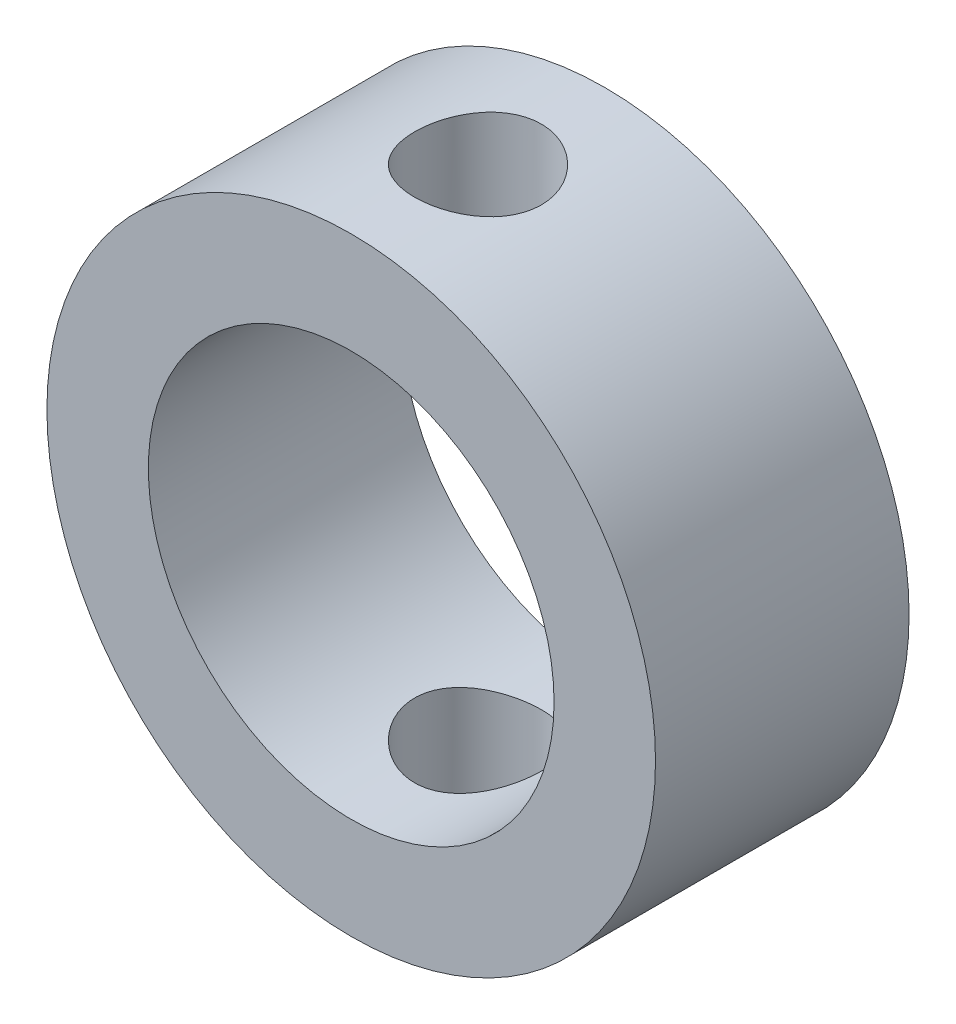
ISO-10303-21;
HEADER;
FILE_DESCRIPTION(('STEP AP214'),'2;1');
FILE_NAME('part.step','',(''),(''),'','','');
FILE_SCHEMA(('AUTOMOTIVE_DESIGN { 1 0 10303 214 1 1 1 1 }'));
ENDSEC;
DATA;
#1=APPLICATION_CONTEXT('core data for automotive mechanical design processes');
#2=APPLICATION_PROTOCOL_DEFINITION('international standard','automotive_design',2000,#1);
#3=PRODUCT_CONTEXT('',#1,'mechanical');
#4=PRODUCT('Part','Part','',(#3));
#5=PRODUCT_RELATED_PRODUCT_CATEGORY('part','',(#4));
#6=PRODUCT_DEFINITION_FORMATION('','',#4);
#7=PRODUCT_DEFINITION_CONTEXT('part definition',#1,'design');
#8=PRODUCT_DEFINITION('design','',#6,#7);
#9=PRODUCT_DEFINITION_SHAPE('','',#8);
#10=(LENGTH_UNIT() NAMED_UNIT(*) SI_UNIT(.MILLI.,.METRE.));
#11=(NAMED_UNIT(*) PLANE_ANGLE_UNIT() SI_UNIT($,.RADIAN.));
#12=(NAMED_UNIT(*) SI_UNIT($,.STERADIAN.) SOLID_ANGLE_UNIT());
#13=UNCERTAINTY_MEASURE_WITH_UNIT(LENGTH_MEASURE(1.E-05),#10,'distance_accuracy_value','');
#14=(GEOMETRIC_REPRESENTATION_CONTEXT(3) GLOBAL_UNCERTAINTY_ASSIGNED_CONTEXT((#13)) GLOBAL_UNIT_ASSIGNED_CONTEXT((#10,
#11,#12)) REPRESENTATION_CONTEXT('',''));
#15=CARTESIAN_POINT('',(0.,0.,0.));
#16=DIRECTION('',(0.,0.,1.));
#17=DIRECTION('',(1.,0.,0.));
#18=AXIS2_PLACEMENT_3D('',#15,#16,#17);
#19=CARTESIAN_POINT('',(0.,0.,-5.));
#20=DIRECTION('',(0.,0.,1.));
#21=DIRECTION('',(-1.,0.,0.));
#22=AXIS2_PLACEMENT_3D('',#19,#20,#21);
#23=CYLINDRICAL_SURFACE('',#22,6.);
#24=CARTESIAN_POINT('',(0.,-6.,-3.75));
#25=CARTESIAN_POINT('',(-0.0694090417016604,-5.99999871526651,-3.74999752253078));
#26=CARTESIAN_POINT('',(-0.138848789520875,-5.99878328775043,-3.74419933428125));
#27=CARTESIAN_POINT('',(-0.275761316266993,-5.9940520099068,-3.72118065046715));
#28=CARTESIAN_POINT('',(-0.343232560128313,-5.99053441189248,-3.70395147696307));
#29=CARTESIAN_POINT('',(-0.474209132291342,-5.98159109196202,-3.65862954507818));
#30=CARTESIAN_POINT('',(-0.537718336709185,-5.97616727052645,-3.63054760400111));
#31=CARTESIAN_POINT('',(-0.659120328605959,-5.96399927809859,-3.56435039114382));
#32=CARTESIAN_POINT('',(-0.717013367534327,-5.95725516625975,-3.52623556884417));
#33=CARTESIAN_POINT('',(-0.826390324308837,-5.9430770002465,-3.44046365980936));
#34=CARTESIAN_POINT('',(-0.877780244162686,-5.93563505848531,-3.39268799876492));
#35=CARTESIAN_POINT('',(-0.971877776769393,-5.92095657692448,-3.28920534080489));
#36=CARTESIAN_POINT('',(-1.01458467096099,-5.91372005416683,-3.23349768812774));
#37=CARTESIAN_POINT('',(-1.09051031677217,-5.90019442595308,-3.11504803123384));
#38=CARTESIAN_POINT('',(-1.12363054680651,-5.89391545174828,-3.05224161549726));
#39=CARTESIAN_POINT('',(-1.17881119348064,-5.8831284065002,-2.92180254822724));
#40=CARTESIAN_POINT('',(-1.20087280167641,-5.87862014467568,-2.85417041755746));
#41=CARTESIAN_POINT('',(-1.23300240133737,-5.87196500986122,-2.71701476258436));
#42=CARTESIAN_POINT('',(-1.24323597696799,-5.86978556855865,-2.64753164066523));
#43=CARTESIAN_POINT('',(-1.25193357655615,-5.86793690716491,-2.50780315713737));
#44=CARTESIAN_POINT('',(-1.25039890894687,-5.86826740800981,-2.4375578811347));
#45=CARTESIAN_POINT('',(-1.23573719037197,-5.87137174319175,-2.29951897202482));
#46=CARTESIAN_POINT('',(-1.2228010523272,-5.87410533679901,-2.23170402033879));
#47=CARTESIAN_POINT('',(-1.18600543529945,-5.88164437615942,-2.09922849035507));
#48=CARTESIAN_POINT('',(-1.16214539481382,-5.88644992841317,-2.03456807439367));
#49=CARTESIAN_POINT('',(-1.10400003213928,-5.89763191464102,-1.90969277158402));
#50=CARTESIAN_POINT('',(-1.06964002534237,-5.90401953785586,-1.84951370347293));
#51=CARTESIAN_POINT('',(-0.991522699274818,-5.91763890010721,-1.73570425573184));
#52=CARTESIAN_POINT('',(-0.947764212262588,-5.92487074398537,-1.68207469116402));
#53=CARTESIAN_POINT('',(-0.851074921546783,-5.93953730929909,-1.58178603891963));
#54=CARTESIAN_POINT('',(-0.797981433412083,-5.94697323199473,-1.53528383110299));
#55=CARTESIAN_POINT('',(-0.684667288611798,-5.96108088143001,-1.45181955777103));
#56=CARTESIAN_POINT('',(-0.624446525025766,-5.96775259670236,-1.4148576354016));
#57=CARTESIAN_POINT('',(-0.498405541235478,-5.97959870942815,-1.35148991846405));
#58=CARTESIAN_POINT('',(-0.4325754619265,-5.98477039710258,-1.32510319543288));
#59=CARTESIAN_POINT('',(-0.297284620972155,-5.99301338211281,-1.28380829516451));
#60=CARTESIAN_POINT('',(-0.227824338595089,-5.99608495596053,-1.2688986067686));
#61=CARTESIAN_POINT('',(-0.0885918657008345,-5.99974275215456,-1.25120574793211));
#62=CARTESIAN_POINT('',(-0.0188480555261778,-6.00037293537579,-1.24820805850575));
#63=CARTESIAN_POINT('',(0.120143798757715,-5.99919952252774,-1.2538449499691));
#64=CARTESIAN_POINT('',(0.189391872962259,-5.99739607548153,-1.2624788186016));
#65=CARTESIAN_POINT('',(0.324726367119814,-5.99158564979184,-1.29095565346953));
#66=CARTESIAN_POINT('',(0.390837192894207,-5.98760052868077,-1.31068748538347));
#67=CARTESIAN_POINT('',(0.518811446661332,-5.97787227242395,-1.36067786042141));
#68=CARTESIAN_POINT('',(0.580674536336776,-5.97212899744579,-1.39093724086598));
#69=CARTESIAN_POINT('',(0.699294306943495,-5.95941241490714,-1.46158037823756));
#70=CARTESIAN_POINT('',(0.755973219469835,-5.9524239381233,-1.50209192956906));
#71=CARTESIAN_POINT('',(0.861805445886521,-5.93802568299709,-1.59191956307627));
#72=CARTESIAN_POINT('',(0.910957877913287,-5.93061585542511,-1.64123667551894));
#73=CARTESIAN_POINT('',(1.0011786486518,-5.91606024531377,-1.7482555769997));
#74=CARTESIAN_POINT('',(1.04209914600205,-5.90892089307501,-1.80608303195528));
#75=CARTESIAN_POINT('',(1.11364719079244,-5.89585601015805,-1.92791628421379));
#76=CARTESIAN_POINT('',(1.14427516677864,-5.88993042894651,-1.9919218241391));
#77=CARTESIAN_POINT('',(1.19417246443922,-5.88001700708041,-2.12396119629823));
#78=CARTESIAN_POINT('',(1.21350309828032,-5.87601872784687,-2.19197103716584));
#79=CARTESIAN_POINT('',(1.24044038523407,-5.87039184709697,-2.33036655049226));
#80=CARTESIAN_POINT('',(1.24804871544441,-5.86876290660367,-2.40075188161944));
#81=CARTESIAN_POINT('',(1.25125926487611,-5.86807907308506,-2.54041340099965));
#82=CARTESIAN_POINT('',(1.24709542622726,-5.86897402321502,-2.60968407022205));
#83=CARTESIAN_POINT('',(1.22739905314032,-5.87312447254927,-2.74651400892022));
#84=CARTESIAN_POINT('',(1.21186662782266,-5.87637994909626,-2.81407329481611));
#85=CARTESIAN_POINT('',(1.16998217768585,-5.88486132447716,-2.94539777189066));
#86=CARTESIAN_POINT('',(1.14366117568421,-5.8900815700793,-3.00917324648693));
#87=CARTESIAN_POINT('',(1.08097457299757,-5.90190705738738,-3.13143877602667));
#88=CARTESIAN_POINT('',(1.0446080398303,-5.9085124276546,-3.18992833963313));
#89=CARTESIAN_POINT('',(0.962073695342411,-5.92251579551146,-3.30112162707945));
#90=CARTESIAN_POINT('',(0.915737890418226,-5.92992613868404,-3.35369912456499));
#91=CARTESIAN_POINT('',(0.814924438115334,-5.94461839583213,-3.45040949322636));
#92=CARTESIAN_POINT('',(0.760444918832968,-5.9519002798488,-3.49454041755149));
#93=CARTESIAN_POINT('',(0.644134427507703,-5.96561444547638,-3.57358857318406));
#94=CARTESIAN_POINT('',(0.582225921521348,-5.97203596073244,-3.60839367988629));
#95=CARTESIAN_POINT('',(0.453319843998454,-5.98319908494092,-3.66705022843002));
#96=CARTESIAN_POINT('',(0.386326781907244,-5.98794216182101,-3.69091124718188));
#97=CARTESIAN_POINT('',(0.266015292900105,-5.99432499781444,-3.72254027828842));
#98=CARTESIAN_POINT('',(0.213367593727929,-5.99644035661395,-3.73281876320886));
#99=CARTESIAN_POINT('',(0.107152674176537,-5.99927832789758,-3.74654945427733));
#100=CARTESIAN_POINT('',(0.053585487848872,-6.00000099184586,-3.75000191266719));
#101=CARTESIAN_POINT('',(0.,-6.,-3.75));
#102=B_SPLINE_CURVE_WITH_KNOTS('',3,(#24,#25,#26,#27,#28,#29,#30,#31,#32,#33,#34,#35,#36,#37,
#38,#39,#40,#41,#42,#43,#44,#45,#46,#47,#48,#49,#50,#51,#52,#53,#54,#55,#56,#57,#58,#59,#60,#61,
#62,#63,#64,#65,#66,#67,#68,#69,#70,#71,#72,#73,#74,#75,#76,#77,#78,#79,#80,#81,#82,#83,#84,#85,
#86,#87,#88,#89,#90,#91,#92,#93,#94,#95,#96,#97,#98,#99,#100,#101),.UNSPECIFIED.,.T.,.F.,(4,2,2,
2,2,2,2,2,2,2,2,2,2,2,2,2,2,2,2,2,2,2,2,2,2,2,2,2,2,2,2,2,2,2,2,2,2,2,4),(0.,0.208031045103183,
0.416220199906225,0.624202378825443,0.83217524157299,1.04287526388123,1.25359271551786,
1.46640449178549,1.6791933328549,1.88896575169855,2.09871484767165,2.3050171212906,
2.5113300003028,2.71914592416749,2.92698768368035,3.13889526355466,3.35080602278218,
3.56309724499663,3.77536051045772,3.98378339407676,4.19219351552278,4.39855286632622,
4.60492863390934,4.81401583995737,5.02312752564574,5.23571263829337,5.4482888985131,
5.65970050095026,5.87108185414185,6.07829223291039,6.28550062281362,6.49211731393256,
6.69875319081481,6.9091902483031,7.1196757511737,7.33258864398257,7.54531486464974,
7.70592588477281,7.86653096973392),.UNSPECIFIED.);
#103=CARTESIAN_POINT('',(0.,-6.,-3.75));
#104=VERTEX_POINT('',#103);
#105=EDGE_CURVE('E53',#104,#104,#102,.T.);
#106=ORIENTED_EDGE('',*,*,#105,.T.);
#107=EDGE_LOOP('',(#106));
#108=FACE_BOUND('',#107,.T.);
#109=CARTESIAN_POINT('',(0.,0.,-5.));
#110=DIRECTION('',(0.,0.,1.));
#111=DIRECTION('',(1.,0.,0.));
#112=AXIS2_PLACEMENT_3D('',#109,#110,#111);
#113=CIRCLE('',#112,6.);
#114=CARTESIAN_POINT('',(6.,0.,-5.));
#115=VERTEX_POINT('',#114);
#116=EDGE_CURVE('E10',#115,#115,#113,.T.);
#117=ORIENTED_EDGE('',*,*,#116,.T.);
#118=EDGE_LOOP('',(#117));
#119=FACE_BOUND('',#118,.T.);
#120=CARTESIAN_POINT('',(0.,0.,0.));
#121=DIRECTION('',(0.,0.,1.));
#122=DIRECTION('',(1.,0.,0.));
#123=AXIS2_PLACEMENT_3D('',#120,#121,#122);
#124=CIRCLE('',#123,6.);
#125=CARTESIAN_POINT('',(6.,0.,0.));
#126=VERTEX_POINT('',#125);
#127=EDGE_CURVE('E38',#126,#126,#124,.T.);
#128=ORIENTED_EDGE('',*,*,#127,.F.);
#129=EDGE_LOOP('',(#128));
#130=FACE_BOUND('',#129,.T.);
#131=CARTESIAN_POINT('',(0.,6.,-1.25));
#132=CARTESIAN_POINT('',(0.069409041701661,5.99999871526651,-1.25000247746922));
#133=CARTESIAN_POINT('',(0.138848789520876,5.99878328775043,-1.25580066571875));
#134=CARTESIAN_POINT('',(0.275761316266994,5.9940520099068,-1.27881934953285));
#135=CARTESIAN_POINT('',(0.343232560128313,5.99053441189248,-1.29604852303693));
#136=CARTESIAN_POINT('',(0.474209132291343,5.98159109196202,-1.34137045492182));
#137=CARTESIAN_POINT('',(0.537718336709186,5.97616727052645,-1.36945239599888));
#138=CARTESIAN_POINT('',(0.659120328605959,5.96399927809859,-1.43564960885618));
#139=CARTESIAN_POINT('',(0.717013367534328,5.95725516625975,-1.47376443115583));
#140=CARTESIAN_POINT('',(0.826390324308838,5.9430770002465,-1.55953634019064));
#141=CARTESIAN_POINT('',(0.877780244162686,5.93563505848531,-1.60731200123508));
#142=CARTESIAN_POINT('',(0.971877776769393,5.92095657692448,-1.71079465919511));
#143=CARTESIAN_POINT('',(1.01458467096099,5.91372005416683,-1.76650231187226));
#144=CARTESIAN_POINT('',(1.09051031677217,5.90019442595308,-1.88495196876616));
#145=CARTESIAN_POINT('',(1.12363054680651,5.89391545174828,-1.94775838450274));
#146=CARTESIAN_POINT('',(1.17881119348064,5.8831284065002,-2.07819745177275));
#147=CARTESIAN_POINT('',(1.20087280167641,5.87862014467568,-2.14582958244254));
#148=CARTESIAN_POINT('',(1.23300240133737,5.87196500986122,-2.28298523741564));
#149=CARTESIAN_POINT('',(1.24323597696799,5.86978556855865,-2.35246835933477));
#150=CARTESIAN_POINT('',(1.25193357655615,5.86793690716491,-2.49219684286263));
#151=CARTESIAN_POINT('',(1.25039890894687,5.86826740800981,-2.5624421188653));
#152=CARTESIAN_POINT('',(1.23573719037197,5.87137174319175,-2.70048102797518));
#153=CARTESIAN_POINT('',(1.2228010523272,5.87410533679901,-2.76829597966121));
#154=CARTESIAN_POINT('',(1.18600543529945,5.88164437615942,-2.90077150964493));
#155=CARTESIAN_POINT('',(1.16214539481382,5.88644992841317,-2.96543192560633));
#156=CARTESIAN_POINT('',(1.10400003213928,5.89763191464102,-3.09030722841598));
#157=CARTESIAN_POINT('',(1.06964002534237,5.90401953785586,-3.15048629652707));
#158=CARTESIAN_POINT('',(0.991522699274819,5.91763890010721,-3.26429574426816));
#159=CARTESIAN_POINT('',(0.947764212262589,5.92487074398537,-3.31792530883598));
#160=CARTESIAN_POINT('',(0.851074921546784,5.93953730929909,-3.41821396108037));
#161=CARTESIAN_POINT('',(0.797981433412084,5.94697323199473,-3.46471616889701));
#162=CARTESIAN_POINT('',(0.684667288611799,5.96108088143001,-3.54818044222897));
#163=CARTESIAN_POINT('',(0.624446525025766,5.96775259670236,-3.5851423645984));
#164=CARTESIAN_POINT('',(0.498405541235479,5.97959870942815,-3.64851008153595));
#165=CARTESIAN_POINT('',(0.432575461926501,5.98477039710258,-3.67489680456712));
#166=CARTESIAN_POINT('',(0.297284620972156,5.99301338211281,-3.71619170483549));
#167=CARTESIAN_POINT('',(0.22782433859509,5.99608495596053,-3.7311013932314));
#168=CARTESIAN_POINT('',(0.0885918657008356,5.99974275215456,-3.74879425206789));
#169=CARTESIAN_POINT('',(0.0188480555261789,6.00037293537579,-3.75179194149425));
#170=CARTESIAN_POINT('',(-0.120143798757714,5.99919952252774,-3.7461550500309));
#171=CARTESIAN_POINT('',(-0.189391872962258,5.99739607548153,-3.7375211813984));
#172=CARTESIAN_POINT('',(-0.324726367119813,5.99158564979184,-3.70904434653047));
#173=CARTESIAN_POINT('',(-0.390837192894205,5.98760052868077,-3.68931251461653));
#174=CARTESIAN_POINT('',(-0.518811446661331,5.97787227242395,-3.63932213957859));
#175=CARTESIAN_POINT('',(-0.580674536336775,5.97212899744579,-3.60906275913402));
#176=CARTESIAN_POINT('',(-0.699294306943494,5.95941241490714,-3.53841962176244));
#177=CARTESIAN_POINT('',(-0.755973219469834,5.9524239381233,-3.49790807043094));
#178=CARTESIAN_POINT('',(-0.86180544588652,5.93802568299709,-3.40808043692373));
#179=CARTESIAN_POINT('',(-0.910957877913286,5.93061585542511,-3.35876332448106));
#180=CARTESIAN_POINT('',(-1.0011786486518,5.91606024531377,-3.2517444230003));
#181=CARTESIAN_POINT('',(-1.04209914600204,5.90892089307501,-3.19391696804472));
#182=CARTESIAN_POINT('',(-1.11364719079243,5.89585601015805,-3.07208371578621));
#183=CARTESIAN_POINT('',(-1.14427516677864,5.88993042894651,-3.00807817586089));
#184=CARTESIAN_POINT('',(-1.19417246443922,5.88001700708041,-2.87603880370177));
#185=CARTESIAN_POINT('',(-1.21350309828032,5.87601872784687,-2.80802896283416));
#186=CARTESIAN_POINT('',(-1.24044038523407,5.87039184709697,-2.66963344950774));
#187=CARTESIAN_POINT('',(-1.24804871544441,5.86876290660367,-2.59924811838056));
#188=CARTESIAN_POINT('',(-1.25125926487611,5.86807907308506,-2.45958659900035));
#189=CARTESIAN_POINT('',(-1.24709542622725,5.86897402321502,-2.39031592977794));
#190=CARTESIAN_POINT('',(-1.22739905314032,5.87312447254927,-2.25348599107978));
#191=CARTESIAN_POINT('',(-1.21186662782266,5.87637994909626,-2.18592670518389));
#192=CARTESIAN_POINT('',(-1.16998217768585,5.88486132447716,-2.05460222810934));
#193=CARTESIAN_POINT('',(-1.14366117568421,5.8900815700793,-1.99082675351307));
#194=CARTESIAN_POINT('',(-1.08097457299757,5.90190705738738,-1.86856122397333));
#195=CARTESIAN_POINT('',(-1.0446080398303,5.9085124276546,-1.81007166036687));
#196=CARTESIAN_POINT('',(-0.962073695342411,5.92251579551146,-1.69887837292055));
#197=CARTESIAN_POINT('',(-0.915737890418226,5.92992613868404,-1.64630087543501));
#198=CARTESIAN_POINT('',(-0.814924438115335,5.94461839583213,-1.54959050677364));
#199=CARTESIAN_POINT('',(-0.760444918832968,5.9519002798488,-1.50545958244851));
#200=CARTESIAN_POINT('',(-0.644134427507703,5.96561444547638,-1.42641142681594));
#201=CARTESIAN_POINT('',(-0.582225921521348,5.97203596073244,-1.39160632011371));
#202=CARTESIAN_POINT('',(-0.453319843998454,5.98319908494092,-1.33294977156998));
#203=CARTESIAN_POINT('',(-0.386326781907244,5.98794216182101,-1.30908875281812));
#204=CARTESIAN_POINT('',(-0.266015292900106,5.99432499781444,-1.27745972171157));
#205=CARTESIAN_POINT('',(-0.213367593727929,5.99644035661395,-1.26718123679114));
#206=CARTESIAN_POINT('',(-0.107152674176537,5.99927832789758,-1.25345054572267));
#207=CARTESIAN_POINT('',(-0.0535854878488718,6.00000099184586,-1.24999808733281));
#208=CARTESIAN_POINT('',(0.,6.,-1.25));
#209=B_SPLINE_CURVE_WITH_KNOTS('',3,(#131,#132,#133,#134,#135,#136,#137,#138,#139,#140,#141,
#142,#143,#144,#145,#146,#147,#148,#149,#150,#151,#152,#153,#154,#155,#156,#157,#158,#159,#160,
#161,#162,#163,#164,#165,#166,#167,#168,#169,#170,#171,#172,#173,#174,#175,#176,#177,#178,#179,
#180,#181,#182,#183,#184,#185,#186,#187,#188,#189,#190,#191,#192,#193,#194,#195,#196,#197,#198,
#199,#200,#201,#202,#203,#204,#205,#206,#207,#208),.UNSPECIFIED.,.T.,.F.,(4,2,2,2,2,2,2,2,2,2,2,
2,2,2,2,2,2,2,2,2,2,2,2,2,2,2,2,2,2,2,2,2,2,2,2,2,2,2,4),(0.,0.208031045103184,
0.416220199906225,0.624202378825443,0.83217524157299,1.04287526388123,1.25359271551786,
1.46640449178549,1.6791933328549,1.88896575169854,2.09871484767165,2.3050171212906,
2.5113300003028,2.71914592416749,2.92698768368035,3.13889526355466,3.35080602278218,
3.56309724499663,3.77536051045772,3.98378339407676,4.19219351552278,4.39855286632622,
4.60492863390933,4.81401583995737,5.02312752564574,5.23571263829337,5.44828889851309,
5.65970050095025,5.87108185414185,6.07829223291039,6.28550062281362,6.49211731393256,
6.69875319081481,6.9091902483031,7.1196757511737,7.33258864398257,7.54531486464974,
7.70592588477281,7.86653096973392),.UNSPECIFIED.);
#210=CARTESIAN_POINT('',(0.,6.,-1.25));
#211=VERTEX_POINT('',#210);
#212=EDGE_CURVE('E61',#211,#211,#209,.T.);
#213=ORIENTED_EDGE('',*,*,#212,.F.);
#214=EDGE_LOOP('',(#213));
#215=FACE_BOUND('',#214,.T.);
#216=ADVANCED_FACE('F35',(#108,#119,#130,#215),#23,.T.);
#217=CARTESIAN_POINT('',(0.,0.,-5.));
#218=DIRECTION('',(0.,0.,1.));
#219=DIRECTION('',(-1.,0.,0.));
#220=AXIS2_PLACEMENT_3D('',#217,#218,#219);
#221=CYLINDRICAL_SURFACE('',#220,4.);
#222=CARTESIAN_POINT('',(0.,0.,0.));
#223=DIRECTION('',(0.,0.,1.));
#224=DIRECTION('',(1.,0.,0.));
#225=AXIS2_PLACEMENT_3D('',#222,#223,#224);
#226=CIRCLE('',#225,4.);
#227=CARTESIAN_POINT('',(4.,0.,0.));
#228=VERTEX_POINT('',#227);
#229=EDGE_CURVE('E47',#228,#228,#226,.T.);
#230=ORIENTED_EDGE('',*,*,#229,.T.);
#231=EDGE_LOOP('',(#230));
#232=FACE_BOUND('',#231,.T.);
#233=CARTESIAN_POINT('',(0.,0.,-5.));
#234=DIRECTION('',(0.,0.,1.));
#235=DIRECTION('',(1.,0.,0.));
#236=AXIS2_PLACEMENT_3D('',#233,#234,#235);
#237=CIRCLE('',#236,4.);
#238=CARTESIAN_POINT('',(4.,0.,-5.));
#239=VERTEX_POINT('',#238);
#240=EDGE_CURVE('E45',#239,#239,#237,.T.);
#241=ORIENTED_EDGE('',*,*,#240,.F.);
#242=EDGE_LOOP('',(#241));
#243=FACE_BOUND('',#242,.T.);
#244=CARTESIAN_POINT('',(0.,-4.,-3.75));
#245=CARTESIAN_POINT('',(-0.0684391851745462,-3.99999965877989,-3.74999955341242));
#246=CARTESIAN_POINT('',(-0.136883052502859,-3.99822694984841,-3.74436077305555));
#247=CARTESIAN_POINT('',(-0.271769209588448,-3.99132894088807,-3.72201375846076));
#248=CARTESIAN_POINT('',(-0.338211042725907,-3.9862028819986,-3.70530301863564));
#249=CARTESIAN_POINT('',(-0.467128543650806,-3.97315815697909,-3.66143062880426));
#250=CARTESIAN_POINT('',(-0.529610176985804,-3.96524381499025,-3.63428515534703));
#251=CARTESIAN_POINT('',(-0.64913480234646,-3.94743969161093,-3.57038268232167));
#252=CARTESIAN_POINT('',(-0.706176935444885,-3.93754959899905,-3.53362416821941));
#253=CARTESIAN_POINT('',(-0.814965334952281,-3.91650213740282,-3.45034400798264));
#254=CARTESIAN_POINT('',(-0.86652002815666,-3.90531715926989,-3.40357911493893));
#255=CARTESIAN_POINT('',(-0.961197382036994,-3.88310046374208,-3.30213160758645));
#256=CARTESIAN_POINT('',(-1.0043184728987,-3.87206877523457,-3.24744752250545));
#257=CARTESIAN_POINT('',(-1.08194336483114,-3.85111144698172,-3.13005543619192));
#258=CARTESIAN_POINT('',(-1.11620784150129,-3.84121988301796,-3.06718252247278));
#259=CARTESIAN_POINT('',(-1.17359741076672,-3.82407801799234,-2.93620768501813));
#260=CARTESIAN_POINT('',(-1.19672543771945,-3.81682702128689,-2.86810714420607));
#261=CARTESIAN_POINT('',(-1.23048459930033,-3.80607606984501,-2.73077192254794));
#262=CARTESIAN_POINT('',(-1.24147110007865,-3.80246972929508,-2.66163315636115));
#263=CARTESIAN_POINT('',(-1.25174555036988,-3.7991005514095,-2.52240688108811));
#264=CARTESIAN_POINT('',(-1.25103660995772,-3.79933669227334,-2.45231962917834));
#265=CARTESIAN_POINT('',(-1.23821824732739,-3.80353189075438,-2.31612553973101));
#266=CARTESIAN_POINT('',(-1.22656057869383,-3.80734341745949,-2.24997087413843));
#267=CARTESIAN_POINT('',(-1.19290813355626,-3.81802025652489,-2.12060784346265));
#268=CARTESIAN_POINT('',(-1.17091225844551,-3.82488589343115,-2.0573997922912));
#269=CARTESIAN_POINT('',(-1.11688874681277,-3.84101044014297,-1.93464805556736));
#270=CARTESIAN_POINT('',(-1.08471925662082,-3.85030284660824,-1.87517138930802));
#271=CARTESIAN_POINT('',(-1.01136020737848,-3.8702185658007,-1.76231223212088));
#272=CARTESIAN_POINT('',(-0.970168305215773,-3.88084222394551,-1.70893132974629));
#273=CARTESIAN_POINT('',(-0.877716954182124,-3.90281527800493,-1.60722505658301));
#274=CARTESIAN_POINT('',(-0.826084570592818,-3.91417569605696,-1.55924044222032));
#275=CARTESIAN_POINT('',(-0.715364408095531,-3.9359157075958,-1.47252810642032));
#276=CARTESIAN_POINT('',(-0.65627607734902,-3.94629522838372,-1.43380107078079));
#277=CARTESIAN_POINT('',(-0.531664610465454,-3.96501294890191,-1.36647231139872));
#278=CARTESIAN_POINT('',(-0.466094906919279,-3.97333460648208,-1.33795186453603));
#279=CARTESIAN_POINT('',(-0.330767977782644,-3.98687955828554,-1.29244699914843));
#280=CARTESIAN_POINT('',(-0.261012030724608,-3.99210379325151,-1.2754590777616));
#281=CARTESIAN_POINT('',(-0.122185157290344,-3.99871389395014,-1.25408195742102));
#282=CARTESIAN_POINT('',(-0.0531918487888414,-4.00024022895439,-1.24923145640648));
#283=CARTESIAN_POINT('',(0.0846303057325856,-3.99969799730981,-1.25096622663733));
#284=CARTESIAN_POINT('',(0.153459174306506,-3.99762995581125,-1.2575498273226));
#285=CARTESIAN_POINT('',(0.287219332975852,-3.99022363769772,-1.28159559260639));
#286=CARTESIAN_POINT('',(0.352204978420948,-3.98496793110725,-1.29878326761251));
#287=CARTESIAN_POINT('',(0.478351928861366,-3.97180121379252,-1.34321435236669));
#288=CARTESIAN_POINT('',(0.539512760449016,-3.96388987514204,-1.37045900402491));
#289=CARTESIAN_POINT('',(0.657932406672232,-3.94598542759568,-1.43497321654879));
#290=CARTESIAN_POINT('',(0.715059739787955,-3.9359462681821,-1.47247098749722));
#291=CARTESIAN_POINT('',(0.822365850960096,-3.91493410002887,-1.55615321011702));
#292=CARTESIAN_POINT('',(0.872542738043337,-3.90396083845862,-1.60234001774311));
#293=CARTESIAN_POINT('',(0.966587462919658,-3.88176994885247,-1.70425889005369));
#294=CARTESIAN_POINT('',(1.01012652339774,-3.87055986714446,-1.76029666374526));
#295=CARTESIAN_POINT('',(1.08721250244909,-3.84961947087602,-1.87912661637074));
#296=CARTESIAN_POINT('',(1.12075957972524,-3.839889132814,-1.94191868800443));
#297=CARTESIAN_POINT('',(1.17670083481141,-3.82311782360754,-2.07234517288586));
#298=CARTESIAN_POINT('',(1.19913819558886,-3.81606646468027,-2.1399596495047));
#299=CARTESIAN_POINT('',(1.23222894320964,-3.80551170941212,-2.2782724933238));
#300=CARTESIAN_POINT('',(1.2428868141461,-3.80200696302675,-2.34896967637131));
#301=CARTESIAN_POINT('',(1.2517940615754,-3.79908292712494,-2.48800408755424));
#302=CARTESIAN_POINT('',(1.25058279621957,-3.79948604683077,-2.55630345381293));
#303=CARTESIAN_POINT('',(1.23708818129474,-3.80390090472383,-2.69167458491918));
#304=CARTESIAN_POINT('',(1.22480534822559,-3.80791247457319,-2.758746406884));
#305=CARTESIAN_POINT('',(1.18987729913378,-3.81896814158112,-2.88879403960178));
#306=CARTESIAN_POINT('',(1.16738642405944,-3.82596698183474,-2.95181544109601));
#307=CARTESIAN_POINT('',(1.11280227335064,-3.84219704261348,-3.07324041353135));
#308=CARTESIAN_POINT('',(1.08070704444254,-3.85142871716522,-3.13164304207768));
#309=CARTESIAN_POINT('',(1.00635675013475,-3.8715348703158,-3.24464597044057));
#310=CARTESIAN_POINT('',(0.963753335241274,-3.88245948922441,-3.29900812950044));
#311=CARTESIAN_POINT('',(0.870208996404848,-3.90448998821726,-3.3999863281118));
#312=CARTESIAN_POINT('',(0.819265842344403,-3.91559591606795,-3.44660028899101));
#313=CARTESIAN_POINT('',(0.708486662823333,-3.93717271952329,-3.53228253836299));
#314=CARTESIAN_POINT('',(0.64841457448738,-3.94761101730634,-3.57105473644997));
#315=CARTESIAN_POINT('',(0.522279138013654,-3.96626769296916,-3.63789891513944));
#316=CARTESIAN_POINT('',(0.456218157795449,-3.97448694315832,-3.66597510214183));
#317=CARTESIAN_POINT('',(0.325747635373978,-3.98720650733461,-3.70859136760847));
#318=CARTESIAN_POINT('',(0.261670337112546,-3.99196240806139,-3.72407486730534));
#319=CARTESIAN_POINT('',(0.131729895440248,-3.99835900340486,-3.74477835996771));
#320=CARTESIAN_POINT('',(0.0658671161396751,-4.00000032839644,-3.750000429804));
#321=CARTESIAN_POINT('',(0.,-4.,-3.75));
#322=B_SPLINE_CURVE_WITH_KNOTS('',3,(#244,#245,#246,#247,#248,#249,#250,#251,#252,#253,#254,
#255,#256,#257,#258,#259,#260,#261,#262,#263,#264,#265,#266,#267,#268,#269,#270,#271,#272,#273,
#274,#275,#276,#277,#278,#279,#280,#281,#282,#283,#284,#285,#286,#287,#288,#289,#290,#291,#292,
#293,#294,#295,#296,#297,#298,#299,#300,#301,#302,#303,#304,#305,#306,#307,#308,#309,#310,#311,
#312,#313,#314,#315,#316,#317,#318,#319,#320,#321),.UNSPECIFIED.,.T.,.F.,(4,2,2,2,2,2,2,2,2,2,2,
2,2,2,2,2,2,2,2,2,2,2,2,2,2,2,2,2,2,2,2,2,2,2,2,2,2,2,4),(0.,0.20507544943251,0.410197323349067,
0.615002479202437,0.819839921558391,1.03037822195158,1.24095567431276,1.45673771247494,
1.67246286279527,1.8816915016721,2.09086450295138,2.29176917422169,2.49269519979063,
2.69655642720545,2.90047066010359,3.113667472796,3.32688007413303,3.5417546068977,
3.75656384494554,3.96307568548238,4.16955735649363,4.37090626722872,4.572280050345,
4.77856324738343,4.98490245709259,5.1994177871314,5.41392970983712,5.62760115751032,
5.84119123892431,6.04512203476054,6.24904331751085,6.44997913396672,6.65095584330174,
6.85979514006362,7.06869037373341,7.28440668126413,7.50003806666338,7.69744636651541,
7.89481470763048),.UNSPECIFIED.);
#323=CARTESIAN_POINT('',(0.,-4.,-3.75));
#324=VERTEX_POINT('',#323);
#325=EDGE_CURVE('E62',#324,#324,#322,.T.);
#326=ORIENTED_EDGE('',*,*,#325,.F.);
#327=EDGE_LOOP('',(#326));
#328=FACE_BOUND('',#327,.T.);
#329=CARTESIAN_POINT('',(0.,4.,-1.25));
#330=CARTESIAN_POINT('',(0.0684391851745468,3.99999965877989,-1.25000044658758));
#331=CARTESIAN_POINT('',(0.13688305250286,3.99822694984841,-1.25563922694445));
#332=CARTESIAN_POINT('',(0.271769209588449,3.99132894088807,-1.27798624153924));
#333=CARTESIAN_POINT('',(0.338211042725908,3.9862028819986,-1.29469698136436));
#334=CARTESIAN_POINT('',(0.467128543650807,3.97315815697909,-1.33856937119574));
#335=CARTESIAN_POINT('',(0.529610176985804,3.96524381499025,-1.36571484465297));
#336=CARTESIAN_POINT('',(0.64913480234646,3.94743969161093,-1.42961731767833));
#337=CARTESIAN_POINT('',(0.706176935444886,3.93754959899905,-1.46637583178059));
#338=CARTESIAN_POINT('',(0.814965334952282,3.91650213740282,-1.54965599201736));
#339=CARTESIAN_POINT('',(0.866520028156661,3.90531715926989,-1.59642088506107));
#340=CARTESIAN_POINT('',(0.961197382036994,3.88310046374208,-1.69786839241355));
#341=CARTESIAN_POINT('',(1.0043184728987,3.87206877523457,-1.75255247749455));
#342=CARTESIAN_POINT('',(1.08194336483114,3.85111144698172,-1.86994456380808));
#343=CARTESIAN_POINT('',(1.11620784150129,3.84121988301796,-1.93281747752722));
#344=CARTESIAN_POINT('',(1.17359741076672,3.82407801799234,-2.06379231498187));
#345=CARTESIAN_POINT('',(1.19672543771945,3.81682702128689,-2.13189285579393));
#346=CARTESIAN_POINT('',(1.23048459930034,3.80607606984501,-2.26922807745206));
#347=CARTESIAN_POINT('',(1.24147110007865,3.80246972929508,-2.33836684363885));
#348=CARTESIAN_POINT('',(1.25174555036988,3.7991005514095,-2.47759311891189));
#349=CARTESIAN_POINT('',(1.25103660995772,3.79933669227334,-2.54768037082166));
#350=CARTESIAN_POINT('',(1.23821824732739,3.80353189075438,-2.68387446026898));
#351=CARTESIAN_POINT('',(1.22656057869383,3.80734341745949,-2.75002912586156));
#352=CARTESIAN_POINT('',(1.19290813355626,3.81802025652489,-2.87939215653735));
#353=CARTESIAN_POINT('',(1.17091225844551,3.82488589343115,-2.9426002077088));
#354=CARTESIAN_POINT('',(1.11688874681277,3.84101044014297,-3.06535194443264));
#355=CARTESIAN_POINT('',(1.08471925662082,3.85030284660824,-3.12482861069198));
#356=CARTESIAN_POINT('',(1.01136020737848,3.8702185658007,-3.23768776787912));
#357=CARTESIAN_POINT('',(0.970168305215774,3.88084222394551,-3.29106867025371));
#358=CARTESIAN_POINT('',(0.877716954182124,3.90281527800493,-3.39277494341699));
#359=CARTESIAN_POINT('',(0.826084570592818,3.91417569605696,-3.44075955777968));
#360=CARTESIAN_POINT('',(0.715364408095531,3.9359157075958,-3.52747189357968));
#361=CARTESIAN_POINT('',(0.656276077349021,3.94629522838372,-3.56619892921921));
#362=CARTESIAN_POINT('',(0.531664610465455,3.96501294890191,-3.63352768860128));
#363=CARTESIAN_POINT('',(0.46609490691928,3.97333460648208,-3.66204813546397));
#364=CARTESIAN_POINT('',(0.330767977782645,3.98687955828554,-3.70755300085157));
#365=CARTESIAN_POINT('',(0.261012030724609,3.99210379325151,-3.7245409222384));
#366=CARTESIAN_POINT('',(0.122185157290345,3.99871389395014,-3.74591804257898));
#367=CARTESIAN_POINT('',(0.0531918487888425,4.00024022895439,-3.75076854359352));
#368=CARTESIAN_POINT('',(-0.0846303057325846,3.99969799730981,-3.74903377336267));
#369=CARTESIAN_POINT('',(-0.153459174306505,3.99762995581125,-3.7424501726774));
#370=CARTESIAN_POINT('',(-0.287219332975852,3.99022363769772,-3.71840440739361));
#371=CARTESIAN_POINT('',(-0.352204978420948,3.98496793110725,-3.70121673238748));
#372=CARTESIAN_POINT('',(-0.478351928861366,3.97180121379252,-3.65678564763331));
#373=CARTESIAN_POINT('',(-0.539512760449016,3.96388987514203,-3.62954099597509));
#374=CARTESIAN_POINT('',(-0.657932406672231,3.94598542759568,-3.56502678345121));
#375=CARTESIAN_POINT('',(-0.715059739787955,3.9359462681821,-3.52752901250278));
#376=CARTESIAN_POINT('',(-0.822365850960096,3.91493410002887,-3.44384678988298));
#377=CARTESIAN_POINT('',(-0.872542738043336,3.90396083845862,-3.39765998225689));
#378=CARTESIAN_POINT('',(-0.966587462919656,3.88176994885247,-3.29574110994631));
#379=CARTESIAN_POINT('',(-1.01012652339774,3.87055986714446,-3.23970333625474));
#380=CARTESIAN_POINT('',(-1.08721250244909,3.84961947087602,-3.12087338362926));
#381=CARTESIAN_POINT('',(-1.12075957972524,3.839889132814,-3.05808131199557));
#382=CARTESIAN_POINT('',(-1.17670083481141,3.82311782360754,-2.92765482711414));
#383=CARTESIAN_POINT('',(-1.19913819558886,3.81606646468027,-2.8600403504953));
#384=CARTESIAN_POINT('',(-1.23222894320964,3.80551170941212,-2.7217275066762));
#385=CARTESIAN_POINT('',(-1.2428868141461,3.80200696302675,-2.65103032362869));
#386=CARTESIAN_POINT('',(-1.2517940615754,3.79908292712494,-2.51199591244576));
#387=CARTESIAN_POINT('',(-1.25058279621957,3.79948604683077,-2.44369654618707));
#388=CARTESIAN_POINT('',(-1.23708818129474,3.80390090472383,-2.30832541508082));
#389=CARTESIAN_POINT('',(-1.22480534822559,3.80791247457319,-2.241253593116));
#390=CARTESIAN_POINT('',(-1.18987729913378,3.81896814158112,-2.11120596039822));
#391=CARTESIAN_POINT('',(-1.16738642405944,3.82596698183474,-2.04818455890399));
#392=CARTESIAN_POINT('',(-1.11280227335064,3.84219704261348,-1.92675958646865));
#393=CARTESIAN_POINT('',(-1.08070704444254,3.85142871716522,-1.86835695792232));
#394=CARTESIAN_POINT('',(-1.00635675013475,3.8715348703158,-1.75535402955943));
#395=CARTESIAN_POINT('',(-0.963753335241274,3.88245948922441,-1.70099187049956));
#396=CARTESIAN_POINT('',(-0.870208996404848,3.90448998821726,-1.6000136718882));
#397=CARTESIAN_POINT('',(-0.819265842344402,3.91559591606795,-1.55339971100899));
#398=CARTESIAN_POINT('',(-0.708486662823332,3.93717271952329,-1.46771746163701));
#399=CARTESIAN_POINT('',(-0.64841457448738,3.94761101730634,-1.42894526355003));
#400=CARTESIAN_POINT('',(-0.522279138013654,3.96626769296916,-1.36210108486056));
#401=CARTESIAN_POINT('',(-0.456218157795449,3.97448694315832,-1.33402489785817));
#402=CARTESIAN_POINT('',(-0.325747635373977,3.98720650733461,-1.29140863239153));
#403=CARTESIAN_POINT('',(-0.261670337112545,3.99196240806139,-1.27592513269466));
#404=CARTESIAN_POINT('',(-0.131729895440247,3.99835900340486,-1.25522164003228));
#405=CARTESIAN_POINT('',(-0.0658671161396744,4.00000032839644,-1.249999570196));
#406=CARTESIAN_POINT('',(0.,4.,-1.25));
#407=B_SPLINE_CURVE_WITH_KNOTS('',3,(#329,#330,#331,#332,#333,#334,#335,#336,#337,#338,#339,
#340,#341,#342,#343,#344,#345,#346,#347,#348,#349,#350,#351,#352,#353,#354,#355,#356,#357,#358,
#359,#360,#361,#362,#363,#364,#365,#366,#367,#368,#369,#370,#371,#372,#373,#374,#375,#376,#377,
#378,#379,#380,#381,#382,#383,#384,#385,#386,#387,#388,#389,#390,#391,#392,#393,#394,#395,#396,
#397,#398,#399,#400,#401,#402,#403,#404,#405,#406),.UNSPECIFIED.,.T.,.F.,(4,2,2,2,2,2,2,2,2,2,2,
2,2,2,2,2,2,2,2,2,2,2,2,2,2,2,2,2,2,2,2,2,2,2,2,2,2,2,4),(0.,0.20507544943251,0.410197323349067,
0.615002479202437,0.819839921558392,1.03037822195158,1.24095567431276,1.45673771247494,
1.67246286279527,1.8816915016721,2.09086450295138,2.29176917422169,2.49269519979063,
2.69655642720545,2.90047066010359,3.113667472796,3.32688007413303,3.5417546068977,
3.75656384494554,3.96307568548238,4.16955735649363,4.37090626722872,4.572280050345,
4.77856324738343,4.98490245709259,5.1994177871314,5.41392970983712,5.62760115751032,
5.84119123892431,6.04512203476054,6.24904331751085,6.44997913396672,6.65095584330174,
6.85979514006362,7.06869037373341,7.28440668126413,7.50003806666338,7.69744636651542,
7.89481470763048),.UNSPECIFIED.);
#408=CARTESIAN_POINT('',(0.,4.,-1.25));
#409=VERTEX_POINT('',#408);
#410=EDGE_CURVE('E50',#409,#409,#407,.T.);
#411=ORIENTED_EDGE('',*,*,#410,.T.);
#412=EDGE_LOOP('',(#411));
#413=FACE_BOUND('',#412,.T.);
#414=ADVANCED_FACE('F76',(#232,#243,#328,#413),#221,.F.);
#415=CARTESIAN_POINT('',(0.,0.,-5.));
#416=DIRECTION('',(0.,0.,-1.));
#417=DIRECTION('',(1.,0.,0.));
#418=AXIS2_PLACEMENT_3D('',#415,#416,#417);
#419=PLANE('',#418);
#420=ORIENTED_EDGE('',*,*,#116,.F.);
#421=EDGE_LOOP('',(#420));
#422=FACE_BOUND('',#421,.T.);
#423=ORIENTED_EDGE('',*,*,#240,.T.);
#424=EDGE_LOOP('',(#423));
#425=FACE_BOUND('',#424,.T.);
#426=ADVANCED_FACE('F80',(#422,#425),#419,.T.);
#427=CARTESIAN_POINT('',(0.,0.,0.));
#428=DIRECTION('',(0.,0.,-1.));
#429=DIRECTION('',(1.,0.,0.));
#430=AXIS2_PLACEMENT_3D('',#427,#428,#429);
#431=PLANE('',#430);
#432=ORIENTED_EDGE('',*,*,#127,.T.);
#433=EDGE_LOOP('',(#432));
#434=FACE_BOUND('',#433,.T.);
#435=ORIENTED_EDGE('',*,*,#229,.F.);
#436=EDGE_LOOP('',(#435));
#437=FACE_BOUND('',#436,.T.);
#438=ADVANCED_FACE('F74',(#434,#437),#431,.F.);
#439=CARTESIAN_POINT('',(0.,-6.001,-2.5));
#440=DIRECTION('',(0.,1.,0.));
#441=DIRECTION('',(0.,0.,-1.));
#442=AXIS2_PLACEMENT_3D('',#439,#440,#441);
#443=CYLINDRICAL_SURFACE('',#442,1.25);
#444=ORIENTED_EDGE('',*,*,#325,.T.);
#445=EDGE_LOOP('',(#444));
#446=FACE_BOUND('',#445,.T.);
#447=ORIENTED_EDGE('',*,*,#105,.F.);
#448=EDGE_LOOP('',(#447));
#449=FACE_BOUND('',#448,.T.);
#450=ADVANCED_FACE('F69',(#446,#449),#443,.F.);
#451=CARTESIAN_POINT('',(0.,6.001,-2.5));
#452=DIRECTION('',(0.,-1.,0.));
#453=DIRECTION('',(0.,0.,1.));
#454=AXIS2_PLACEMENT_3D('',#451,#452,#453);
#455=CYLINDRICAL_SURFACE('',#454,1.25);
#456=ORIENTED_EDGE('',*,*,#410,.F.);
#457=EDGE_LOOP('',(#456));
#458=FACE_BOUND('',#457,.T.);
#459=ORIENTED_EDGE('',*,*,#212,.T.);
#460=EDGE_LOOP('',(#459));
#461=FACE_BOUND('',#460,.T.);
#462=ADVANCED_FACE('F73',(#458,#461),#455,.F.);
#463=CLOSED_SHELL('',(#216,#414,#426,#438,#450,#462));
#464=MANIFOLD_SOLID_BREP('B2',#463);
#465=ADVANCED_BREP_SHAPE_REPRESENTATION('',(#18,#464),#14);
#466=SHAPE_DEFINITION_REPRESENTATION(#9,#465);
ENDSEC;
END-ISO-10303-21;
